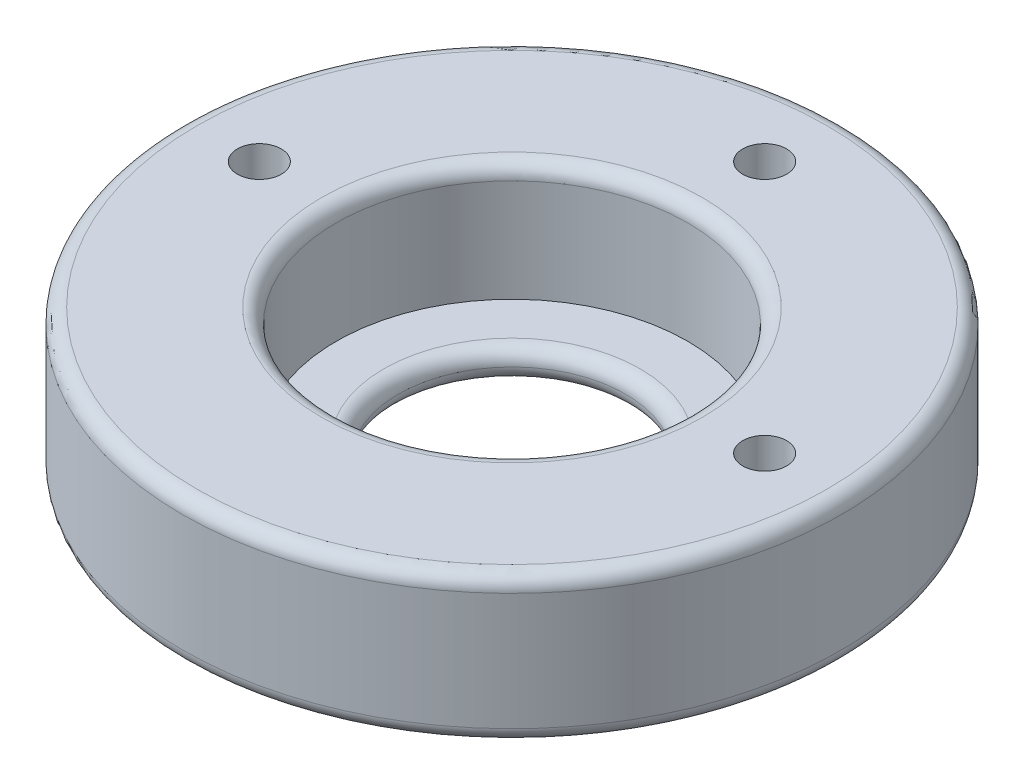
ISO-10303-21;
HEADER;
FILE_DESCRIPTION(('STEP AP214'),'2;1');
FILE_NAME('part.step','',(''),(''),'','','');
FILE_SCHEMA(('AUTOMOTIVE_DESIGN { 1 0 10303 214 1 1 1 1 }'));
ENDSEC;
DATA;
#1=APPLICATION_CONTEXT('core data for automotive mechanical design processes');
#2=APPLICATION_PROTOCOL_DEFINITION('international standard','automotive_design',2000,#1);
#3=PRODUCT_CONTEXT('',#1,'mechanical');
#4=PRODUCT('Part','Part','',(#3));
#5=PRODUCT_RELATED_PRODUCT_CATEGORY('part','',(#4));
#6=PRODUCT_DEFINITION_FORMATION('','',#4);
#7=PRODUCT_DEFINITION_CONTEXT('part definition',#1,'design');
#8=PRODUCT_DEFINITION('design','',#6,#7);
#9=PRODUCT_DEFINITION_SHAPE('','',#8);
#10=(LENGTH_UNIT() NAMED_UNIT(*) SI_UNIT(.MILLI.,.METRE.));
#11=(NAMED_UNIT(*) PLANE_ANGLE_UNIT() SI_UNIT($,.RADIAN.));
#12=(NAMED_UNIT(*) SI_UNIT($,.STERADIAN.) SOLID_ANGLE_UNIT());
#13=UNCERTAINTY_MEASURE_WITH_UNIT(LENGTH_MEASURE(1.E-05),#10,'distance_accuracy_value','');
#14=(GEOMETRIC_REPRESENTATION_CONTEXT(3) GLOBAL_UNCERTAINTY_ASSIGNED_CONTEXT((#13)) GLOBAL_UNIT_ASSIGNED_CONTEXT((#10,
#11,#12)) REPRESENTATION_CONTEXT('',''));
#15=CARTESIAN_POINT('',(0.,0.,0.));
#16=DIRECTION('',(0.,0.,1.));
#17=DIRECTION('',(1.,0.,0.));
#18=AXIS2_PLACEMENT_3D('',#15,#16,#17);
#19=CARTESIAN_POINT('',(17.25,10.,0.));
#20=DIRECTION('',(0.,-1.,0.));
#21=DIRECTION('',(0.,0.,-1.));
#22=AXIS2_PLACEMENT_3D('',#19,#20,#21);
#23=CYLINDRICAL_SURFACE('',#22,1.5);
#24=CARTESIAN_POINT('',(17.25,4.,0.));
#25=DIRECTION('',(0.,1.,0.));
#26=DIRECTION('',(0.,0.,1.));
#27=AXIS2_PLACEMENT_3D('',#24,#25,#26);
#28=CIRCLE('',#27,1.5);
#29=CARTESIAN_POINT('',(17.25,4.,1.5));
#30=VERTEX_POINT('',#29);
#31=EDGE_CURVE('E43',#30,#30,#28,.T.);
#32=ORIENTED_EDGE('',*,*,#31,.F.);
#33=EDGE_LOOP('',(#32));
#34=FACE_BOUND('',#33,.T.);
#35=CARTESIAN_POINT('',(17.25,10.,0.));
#36=DIRECTION('',(0.,1.,0.));
#37=DIRECTION('',(0.,0.,1.));
#38=AXIS2_PLACEMENT_3D('',#35,#36,#37);
#39=CIRCLE('',#38,1.5);
#40=CARTESIAN_POINT('',(17.25,10.,1.5));
#41=VERTEX_POINT('',#40);
#42=EDGE_CURVE('E85',#41,#41,#39,.T.);
#43=ORIENTED_EDGE('',*,*,#42,.T.);
#44=EDGE_LOOP('',(#43));
#45=FACE_BOUND('',#44,.T.);
#46=ADVANCED_FACE('F39',(#34,#45),#23,.F.);
#47=CARTESIAN_POINT('',(-17.25,10.,0.));
#48=DIRECTION('',(0.,-1.,0.));
#49=DIRECTION('',(0.,0.,-1.));
#50=AXIS2_PLACEMENT_3D('',#47,#48,#49);
#51=CYLINDRICAL_SURFACE('',#50,1.5);
#52=CARTESIAN_POINT('',(-17.25,4.,0.));
#53=DIRECTION('',(0.,1.,0.));
#54=DIRECTION('',(0.,0.,1.));
#55=AXIS2_PLACEMENT_3D('',#52,#53,#54);
#56=CIRCLE('',#55,1.5);
#57=CARTESIAN_POINT('',(-17.25,4.,1.5));
#58=VERTEX_POINT('',#57);
#59=EDGE_CURVE('E66',#58,#58,#56,.T.);
#60=ORIENTED_EDGE('',*,*,#59,.F.);
#61=EDGE_LOOP('',(#60));
#62=FACE_BOUND('',#61,.T.);
#63=CARTESIAN_POINT('',(-17.25,10.,0.));
#64=DIRECTION('',(0.,1.,0.));
#65=DIRECTION('',(0.,0.,1.));
#66=AXIS2_PLACEMENT_3D('',#63,#64,#65);
#67=CIRCLE('',#66,1.5);
#68=CARTESIAN_POINT('',(-17.25,10.,1.5));
#69=VERTEX_POINT('',#68);
#70=EDGE_CURVE('E89',#69,#69,#67,.T.);
#71=ORIENTED_EDGE('',*,*,#70,.T.);
#72=EDGE_LOOP('',(#71));
#73=FACE_BOUND('',#72,.T.);
#74=ADVANCED_FACE('F81',(#62,#73),#51,.F.);
#75=CARTESIAN_POINT('',(0.,10.,-17.25));
#76=DIRECTION('',(0.,-1.,0.));
#77=DIRECTION('',(0.,0.,-1.));
#78=AXIS2_PLACEMENT_3D('',#75,#76,#77);
#79=CYLINDRICAL_SURFACE('',#78,1.5);
#80=CARTESIAN_POINT('',(0.,4.,-17.25));
#81=DIRECTION('',(0.,1.,0.));
#82=DIRECTION('',(0.,0.,1.));
#83=AXIS2_PLACEMENT_3D('',#80,#81,#82);
#84=CIRCLE('',#83,1.5);
#85=CARTESIAN_POINT('',(0.,4.,-15.75));
#86=VERTEX_POINT('',#85);
#87=EDGE_CURVE('E63',#86,#86,#84,.T.);
#88=ORIENTED_EDGE('',*,*,#87,.F.);
#89=EDGE_LOOP('',(#88));
#90=FACE_BOUND('',#89,.T.);
#91=CARTESIAN_POINT('',(0.,10.,-17.25));
#92=DIRECTION('',(0.,1.,0.));
#93=DIRECTION('',(0.,0.,1.));
#94=AXIS2_PLACEMENT_3D('',#91,#92,#93);
#95=CIRCLE('',#94,1.5);
#96=CARTESIAN_POINT('',(0.,10.,-15.75));
#97=VERTEX_POINT('',#96);
#98=EDGE_CURVE('E97',#97,#97,#95,.T.);
#99=ORIENTED_EDGE('',*,*,#98,.T.);
#100=EDGE_LOOP('',(#99));
#101=FACE_BOUND('',#100,.T.);
#102=ADVANCED_FACE('F144',(#90,#101),#79,.F.);
#103=CARTESIAN_POINT('',(0.,10.,0.));
#104=DIRECTION('',(0.,-1.,0.));
#105=DIRECTION('',(0.,0.,-1.));
#106=AXIS2_PLACEMENT_3D('',#103,#104,#105);
#107=CYLINDRICAL_SURFACE('',#106,22.5);
#108=CARTESIAN_POINT('',(0.,0.999999999999999,0.));
#109=DIRECTION('',(0.,1.,0.));
#110=DIRECTION('',(0.,0.,1.));
#111=AXIS2_PLACEMENT_3D('',#108,#109,#110);
#112=CIRCLE('',#111,22.5);
#113=CARTESIAN_POINT('',(0.,0.999999999999999,22.5));
#114=VERTEX_POINT('',#113);
#115=EDGE_CURVE('E112',#114,#114,#112,.T.);
#116=ORIENTED_EDGE('',*,*,#115,.T.);
#117=EDGE_LOOP('',(#116));
#118=FACE_BOUND('',#117,.T.);
#119=CARTESIAN_POINT('',(0.,9.,0.));
#120=DIRECTION('',(0.,1.,0.));
#121=DIRECTION('',(0.,0.,1.));
#122=AXIS2_PLACEMENT_3D('',#119,#120,#121);
#123=CIRCLE('',#122,22.5);
#124=CARTESIAN_POINT('',(0.,9.,22.5));
#125=VERTEX_POINT('',#124);
#126=EDGE_CURVE('E108',#125,#125,#123,.F.);
#127=ORIENTED_EDGE('',*,*,#126,.T.);
#128=EDGE_LOOP('',(#127));
#129=FACE_BOUND('',#128,.T.);
#130=ADVANCED_FACE('F147',(#118,#129),#107,.T.);
#131=CARTESIAN_POINT('',(0.,10.,0.));
#132=DIRECTION('',(0.,1.,0.));
#133=DIRECTION('',(0.,0.,1.));
#134=AXIS2_PLACEMENT_3D('',#131,#132,#133);
#135=PLANE('',#134);
#136=CARTESIAN_POINT('',(0.,10.,0.));
#137=DIRECTION('',(0.,1.,0.));
#138=DIRECTION('',(0.,0.,1.));
#139=AXIS2_PLACEMENT_3D('',#136,#137,#138);
#140=CIRCLE('',#139,13.);
#141=CARTESIAN_POINT('',(0.,10.,13.));
#142=VERTEX_POINT('',#141);
#143=EDGE_CURVE('E10',#142,#142,#140,.F.);
#144=ORIENTED_EDGE('',*,*,#143,.T.);
#145=EDGE_LOOP('',(#144));
#146=FACE_BOUND('',#145,.T.);
#147=CARTESIAN_POINT('',(0.,10.,0.));
#148=DIRECTION('',(0.,1.,0.));
#149=DIRECTION('',(0.,0.,1.));
#150=AXIS2_PLACEMENT_3D('',#147,#148,#149);
#151=CIRCLE('',#150,21.5);
#152=CARTESIAN_POINT('',(0.,10.,21.5));
#153=VERTEX_POINT('',#152);
#154=EDGE_CURVE('E48',#153,#153,#151,.T.);
#155=ORIENTED_EDGE('',*,*,#154,.T.);
#156=EDGE_LOOP('',(#155));
#157=FACE_BOUND('',#156,.T.);
#158=ORIENTED_EDGE('',*,*,#98,.F.);
#159=EDGE_LOOP('',(#158));
#160=FACE_BOUND('',#159,.T.);
#161=ORIENTED_EDGE('',*,*,#70,.F.);
#162=EDGE_LOOP('',(#161));
#163=FACE_BOUND('',#162,.T.);
#164=ORIENTED_EDGE('',*,*,#42,.F.);
#165=EDGE_LOOP('',(#164));
#166=FACE_BOUND('',#165,.T.);
#167=ADVANCED_FACE('F154',(#146,#157,#160,#163,#166),#135,.T.);
#168=CARTESIAN_POINT('',(0.,0.,0.));
#169=DIRECTION('',(0.,1.,0.));
#170=DIRECTION('',(0.,0.,1.));
#171=AXIS2_PLACEMENT_3D('',#168,#169,#170);
#172=PLANE('',#171);
#173=CARTESIAN_POINT('',(17.25,0.,0.));
#174=DIRECTION('',(0.,1.,0.));
#175=DIRECTION('',(0.,0.,1.));
#176=AXIS2_PLACEMENT_3D('',#173,#174,#175);
#177=CIRCLE('',#176,3.);
#178=CARTESIAN_POINT('',(17.25,0.,3.));
#179=VERTEX_POINT('',#178);
#180=EDGE_CURVE('E309',#179,#179,#177,.T.);
#181=ORIENTED_EDGE('',*,*,#180,.T.);
#182=EDGE_LOOP('',(#181));
#183=FACE_BOUND('',#182,.T.);
#184=CARTESIAN_POINT('',(0.,0.,-17.25));
#185=DIRECTION('',(0.,1.,0.));
#186=DIRECTION('',(0.,0.,1.));
#187=AXIS2_PLACEMENT_3D('',#184,#185,#186);
#188=CIRCLE('',#187,3.);
#189=CARTESIAN_POINT('',(0.,0.,-14.25));
#190=VERTEX_POINT('',#189);
#191=EDGE_CURVE('E311',#190,#190,#188,.T.);
#192=ORIENTED_EDGE('',*,*,#191,.T.);
#193=EDGE_LOOP('',(#192));
#194=FACE_BOUND('',#193,.T.);
#195=CARTESIAN_POINT('',(-17.25,0.,0.));
#196=DIRECTION('',(0.,1.,0.));
#197=DIRECTION('',(0.,0.,1.));
#198=AXIS2_PLACEMENT_3D('',#195,#196,#197);
#199=CIRCLE('',#198,3.);
#200=CARTESIAN_POINT('',(-17.25,0.,3.));
#201=VERTEX_POINT('',#200);
#202=EDGE_CURVE('E323',#201,#201,#199,.T.);
#203=ORIENTED_EDGE('',*,*,#202,.T.);
#204=EDGE_LOOP('',(#203));
#205=FACE_BOUND('',#204,.T.);
#206=CARTESIAN_POINT('',(0.,0.,0.));
#207=DIRECTION('',(0.,1.,0.));
#208=DIRECTION('',(0.,0.,1.));
#209=AXIS2_PLACEMENT_3D('',#206,#207,#208);
#210=CIRCLE('',#209,8.75);
#211=CARTESIAN_POINT('',(0.,0.,8.75));
#212=VERTEX_POINT('',#211);
#213=EDGE_CURVE('E104',#212,#212,#210,.T.);
#214=ORIENTED_EDGE('',*,*,#213,.T.);
#215=EDGE_LOOP('',(#214));
#216=FACE_BOUND('',#215,.T.);
#217=CARTESIAN_POINT('',(0.,0.,0.));
#218=DIRECTION('',(0.,1.,0.));
#219=DIRECTION('',(0.,0.,1.));
#220=AXIS2_PLACEMENT_3D('',#217,#218,#219);
#221=CIRCLE('',#220,21.5);
#222=CARTESIAN_POINT('',(0.,0.,21.5));
#223=VERTEX_POINT('',#222);
#224=EDGE_CURVE('E94',#223,#223,#221,.F.);
#225=ORIENTED_EDGE('',*,*,#224,.T.);
#226=EDGE_LOOP('',(#225));
#227=FACE_BOUND('',#226,.T.);
#228=ADVANCED_FACE('F156',(#183,#194,#205,#216,#227),#172,.F.);
#229=CARTESIAN_POINT('',(0.,2.,0.));
#230=DIRECTION('',(0.,1.,0.));
#231=DIRECTION('',(0.,0.,1.));
#232=AXIS2_PLACEMENT_3D('',#229,#230,#231);
#233=CYLINDRICAL_SURFACE('',#232,12.);
#234=CARTESIAN_POINT('',(0.,9.,0.));
#235=DIRECTION('',(0.,1.,0.));
#236=DIRECTION('',(0.,0.,1.));
#237=AXIS2_PLACEMENT_3D('',#234,#235,#236);
#238=CIRCLE('',#237,12.);
#239=CARTESIAN_POINT('',(0.,9.,12.));
#240=VERTEX_POINT('',#239);
#241=EDGE_CURVE('E54',#240,#240,#238,.T.);
#242=ORIENTED_EDGE('',*,*,#241,.T.);
#243=EDGE_LOOP('',(#242));
#244=FACE_BOUND('',#243,.T.);
#245=CARTESIAN_POINT('',(0.,2.,0.));
#246=DIRECTION('',(0.,1.,0.));
#247=DIRECTION('',(0.,0.,1.));
#248=AXIS2_PLACEMENT_3D('',#245,#246,#247);
#249=CIRCLE('',#248,12.);
#250=CARTESIAN_POINT('',(0.,2.,12.));
#251=VERTEX_POINT('',#250);
#252=EDGE_CURVE('E62',#251,#251,#249,.T.);
#253=ORIENTED_EDGE('',*,*,#252,.F.);
#254=EDGE_LOOP('',(#253));
#255=FACE_BOUND('',#254,.T.);
#256=ADVANCED_FACE('F119',(#244,#255),#233,.F.);
#257=CARTESIAN_POINT('',(0.,2.,0.));
#258=DIRECTION('',(0.,1.,0.));
#259=DIRECTION('',(0.,0.,1.));
#260=AXIS2_PLACEMENT_3D('',#257,#258,#259);
#261=PLANE('',#260);
#262=CARTESIAN_POINT('',(0.,2.,0.));
#263=DIRECTION('',(0.,1.,0.));
#264=DIRECTION('',(0.,0.,1.));
#265=AXIS2_PLACEMENT_3D('',#262,#263,#264);
#266=CIRCLE('',#265,8.75);
#267=CARTESIAN_POINT('',(0.,2.,8.75));
#268=VERTEX_POINT('',#267);
#269=EDGE_CURVE('E88',#268,#268,#266,.F.);
#270=ORIENTED_EDGE('',*,*,#269,.T.);
#271=EDGE_LOOP('',(#270));
#272=FACE_BOUND('',#271,.T.);
#273=ORIENTED_EDGE('',*,*,#252,.T.);
#274=EDGE_LOOP('',(#273));
#275=FACE_BOUND('',#274,.T.);
#276=ADVANCED_FACE('F139',(#272,#275),#261,.T.);
#277=CARTESIAN_POINT('',(0.,1.,0.));
#278=DIRECTION('',(0.,1.,0.));
#279=DIRECTION('',(0.,0.,1.));
#280=AXIS2_PLACEMENT_3D('',#277,#278,#279);
#281=TOROIDAL_SURFACE('',#280,8.75,1.);
#282=ORIENTED_EDGE('',*,*,#213,.F.);
#283=EDGE_LOOP('',(#282));
#284=FACE_BOUND('',#283,.T.);
#285=CARTESIAN_POINT('',(0.,1.,0.));
#286=DIRECTION('',(0.,1.,0.));
#287=DIRECTION('',(0.,0.,1.));
#288=AXIS2_PLACEMENT_3D('',#285,#286,#287);
#289=CIRCLE('',#288,7.75);
#290=CARTESIAN_POINT('',(0.,1.,7.75));
#291=VERTEX_POINT('',#290);
#292=EDGE_CURVE('E58',#291,#291,#289,.F.);
#293=ORIENTED_EDGE('',*,*,#292,.F.);
#294=EDGE_LOOP('',(#293));
#295=FACE_BOUND('',#294,.T.);
#296=ADVANCED_FACE('F136',(#284,#295),#281,.T.);
#297=CARTESIAN_POINT('',(0.,1.,0.));
#298=DIRECTION('',(0.,1.,0.));
#299=DIRECTION('',(0.,0.,1.));
#300=AXIS2_PLACEMENT_3D('',#297,#298,#299);
#301=TOROIDAL_SURFACE('',#300,8.75,1.);
#302=ORIENTED_EDGE('',*,*,#269,.F.);
#303=EDGE_LOOP('',(#302));
#304=FACE_BOUND('',#303,.T.);
#305=ORIENTED_EDGE('',*,*,#292,.T.);
#306=EDGE_LOOP('',(#305));
#307=FACE_BOUND('',#306,.T.);
#308=ADVANCED_FACE('F132',(#304,#307),#301,.T.);
#309=CARTESIAN_POINT('',(0.,0.999999999999999,0.));
#310=DIRECTION('',(0.,1.,0.));
#311=DIRECTION('',(0.,0.,1.));
#312=AXIS2_PLACEMENT_3D('',#309,#310,#311);
#313=TOROIDAL_SURFACE('',#312,21.5,1.);
#314=ORIENTED_EDGE('',*,*,#224,.F.);
#315=EDGE_LOOP('',(#314));
#316=FACE_BOUND('',#315,.T.);
#317=ORIENTED_EDGE('',*,*,#115,.F.);
#318=EDGE_LOOP('',(#317));
#319=FACE_BOUND('',#318,.T.);
#320=ADVANCED_FACE('F124',(#316,#319),#313,.T.);
#321=CARTESIAN_POINT('',(0.,9.,0.));
#322=DIRECTION('',(0.,1.,0.));
#323=DIRECTION('',(0.,0.,1.));
#324=AXIS2_PLACEMENT_3D('',#321,#322,#323);
#325=TOROIDAL_SURFACE('',#324,13.,1.);
#326=ORIENTED_EDGE('',*,*,#143,.F.);
#327=EDGE_LOOP('',(#326));
#328=FACE_BOUND('',#327,.T.);
#329=ORIENTED_EDGE('',*,*,#241,.F.);
#330=EDGE_LOOP('',(#329));
#331=FACE_BOUND('',#330,.T.);
#332=ADVANCED_FACE('F122',(#328,#331),#325,.T.);
#333=CARTESIAN_POINT('',(0.,9.,0.));
#334=DIRECTION('',(0.,1.,0.));
#335=DIRECTION('',(0.,0.,1.));
#336=AXIS2_PLACEMENT_3D('',#333,#334,#335);
#337=TOROIDAL_SURFACE('',#336,21.5,1.);
#338=ORIENTED_EDGE('',*,*,#126,.F.);
#339=EDGE_LOOP('',(#338));
#340=FACE_BOUND('',#339,.T.);
#341=ORIENTED_EDGE('',*,*,#154,.F.);
#342=EDGE_LOOP('',(#341));
#343=FACE_BOUND('',#342,.T.);
#344=ADVANCED_FACE('F41',(#340,#343),#337,.T.);
#345=CARTESIAN_POINT('',(-17.25,4.,0.));
#346=DIRECTION('',(0.,-1.,0.));
#347=DIRECTION('',(0.,0.,-1.));
#348=AXIS2_PLACEMENT_3D('',#345,#346,#347);
#349=CYLINDRICAL_SURFACE('',#348,3.);
#350=CARTESIAN_POINT('',(-17.25,4.,0.));
#351=DIRECTION('',(0.,1.,0.));
#352=DIRECTION('',(0.,0.,1.));
#353=AXIS2_PLACEMENT_3D('',#350,#351,#352);
#354=CIRCLE('',#353,3.);
#355=CARTESIAN_POINT('',(-17.25,4.,3.));
#356=VERTEX_POINT('',#355);
#357=EDGE_CURVE('E327',#356,#356,#354,.T.);
#358=ORIENTED_EDGE('',*,*,#357,.T.);
#359=EDGE_LOOP('',(#358));
#360=FACE_BOUND('',#359,.T.);
#361=ORIENTED_EDGE('',*,*,#202,.F.);
#362=EDGE_LOOP('',(#361));
#363=FACE_BOUND('',#362,.T.);
#364=ADVANCED_FACE('F130',(#360,#363),#349,.F.);
#365=CARTESIAN_POINT('',(-17.25,4.,0.));
#366=DIRECTION('',(0.,1.,0.));
#367=DIRECTION('',(0.,0.,1.));
#368=AXIS2_PLACEMENT_3D('',#365,#366,#367);
#369=PLANE('',#368);
#370=ORIENTED_EDGE('',*,*,#59,.T.);
#371=EDGE_LOOP('',(#370));
#372=FACE_BOUND('',#371,.T.);
#373=ORIENTED_EDGE('',*,*,#357,.F.);
#374=EDGE_LOOP('',(#373));
#375=FACE_BOUND('',#374,.T.);
#376=ADVANCED_FACE('F167',(#372,#375),#369,.F.);
#377=CARTESIAN_POINT('',(0.,4.,-17.25));
#378=DIRECTION('',(0.,-1.,0.));
#379=DIRECTION('',(0.,0.,-1.));
#380=AXIS2_PLACEMENT_3D('',#377,#378,#379);
#381=CYLINDRICAL_SURFACE('',#380,3.);
#382=CARTESIAN_POINT('',(0.,4.,-17.25));
#383=DIRECTION('',(0.,1.,0.));
#384=DIRECTION('',(0.,0.,1.));
#385=AXIS2_PLACEMENT_3D('',#382,#383,#384);
#386=CIRCLE('',#385,3.);
#387=CARTESIAN_POINT('',(0.,4.,-14.25));
#388=VERTEX_POINT('',#387);
#389=EDGE_CURVE('E317',#388,#388,#386,.T.);
#390=ORIENTED_EDGE('',*,*,#389,.T.);
#391=EDGE_LOOP('',(#390));
#392=FACE_BOUND('',#391,.T.);
#393=ORIENTED_EDGE('',*,*,#191,.F.);
#394=EDGE_LOOP('',(#393));
#395=FACE_BOUND('',#394,.T.);
#396=ADVANCED_FACE('F170',(#392,#395),#381,.F.);
#397=CARTESIAN_POINT('',(0.,4.,-17.25));
#398=DIRECTION('',(0.,1.,0.));
#399=DIRECTION('',(0.,0.,1.));
#400=AXIS2_PLACEMENT_3D('',#397,#398,#399);
#401=PLANE('',#400);
#402=ORIENTED_EDGE('',*,*,#87,.T.);
#403=EDGE_LOOP('',(#402));
#404=FACE_BOUND('',#403,.T.);
#405=ORIENTED_EDGE('',*,*,#389,.F.);
#406=EDGE_LOOP('',(#405));
#407=FACE_BOUND('',#406,.T.);
#408=ADVANCED_FACE('F174',(#404,#407),#401,.F.);
#409=CARTESIAN_POINT('',(17.25,4.,0.));
#410=DIRECTION('',(0.,-1.,0.));
#411=DIRECTION('',(0.,0.,-1.));
#412=AXIS2_PLACEMENT_3D('',#409,#410,#411);
#413=CYLINDRICAL_SURFACE('',#412,3.);
#414=CARTESIAN_POINT('',(17.25,4.,0.));
#415=DIRECTION('',(0.,1.,0.));
#416=DIRECTION('',(0.,0.,1.));
#417=AXIS2_PLACEMENT_3D('',#414,#415,#416);
#418=CIRCLE('',#417,3.);
#419=CARTESIAN_POINT('',(17.25,4.,3.));
#420=VERTEX_POINT('',#419);
#421=EDGE_CURVE('E67',#420,#420,#418,.T.);
#422=ORIENTED_EDGE('',*,*,#421,.T.);
#423=EDGE_LOOP('',(#422));
#424=FACE_BOUND('',#423,.T.);
#425=ORIENTED_EDGE('',*,*,#180,.F.);
#426=EDGE_LOOP('',(#425));
#427=FACE_BOUND('',#426,.T.);
#428=ADVANCED_FACE('F177',(#424,#427),#413,.F.);
#429=CARTESIAN_POINT('',(17.25,4.,0.));
#430=DIRECTION('',(0.,1.,0.));
#431=DIRECTION('',(0.,0.,1.));
#432=AXIS2_PLACEMENT_3D('',#429,#430,#431);
#433=PLANE('',#432);
#434=ORIENTED_EDGE('',*,*,#31,.T.);
#435=EDGE_LOOP('',(#434));
#436=FACE_BOUND('',#435,.T.);
#437=ORIENTED_EDGE('',*,*,#421,.F.);
#438=EDGE_LOOP('',(#437));
#439=FACE_BOUND('',#438,.T.);
#440=ADVANCED_FACE('F76',(#436,#439),#433,.F.);
#441=CLOSED_SHELL('',(#46,#74,#102,#130,#167,#228,#256,#276,#296,#308,#320,#332,#344,#364,#376,
#396,#408,#428,#440));
#442=MANIFOLD_SOLID_BREP('B2',#441);
#443=ADVANCED_BREP_SHAPE_REPRESENTATION('',(#18,#442),#14);
#444=SHAPE_DEFINITION_REPRESENTATION(#9,#443);
ENDSEC;
END-ISO-10303-21;
